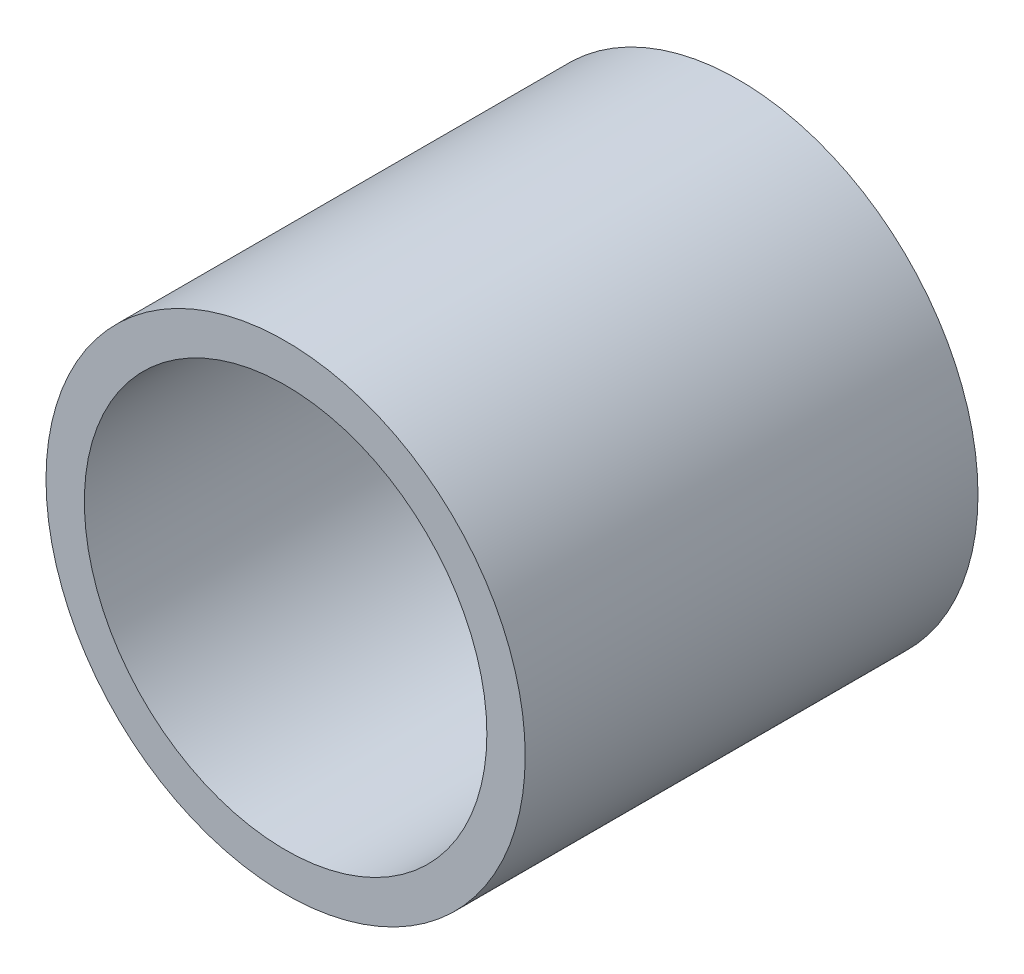
ISO-10303-21;
HEADER;
FILE_DESCRIPTION(('STEP AP214'),'2;1');
FILE_NAME('part.step','',(''),(''),'','','');
FILE_SCHEMA(('AUTOMOTIVE_DESIGN { 1 0 10303 214 1 1 1 1 }'));
ENDSEC;
DATA;
#1=APPLICATION_CONTEXT('core data for automotive mechanical design processes');
#2=APPLICATION_PROTOCOL_DEFINITION('international standard','automotive_design',2000,#1);
#3=PRODUCT_CONTEXT('',#1,'mechanical');
#4=PRODUCT('Part','Part','',(#3));
#5=PRODUCT_RELATED_PRODUCT_CATEGORY('part','',(#4));
#6=PRODUCT_DEFINITION_FORMATION('','',#4);
#7=PRODUCT_DEFINITION_CONTEXT('part definition',#1,'design');
#8=PRODUCT_DEFINITION('design','',#6,#7);
#9=PRODUCT_DEFINITION_SHAPE('','',#8);
#10=(LENGTH_UNIT() NAMED_UNIT(*) SI_UNIT(.MILLI.,.METRE.));
#11=(NAMED_UNIT(*) PLANE_ANGLE_UNIT() SI_UNIT($,.RADIAN.));
#12=(NAMED_UNIT(*) SI_UNIT($,.STERADIAN.) SOLID_ANGLE_UNIT());
#13=UNCERTAINTY_MEASURE_WITH_UNIT(LENGTH_MEASURE(1.E-05),#10,'distance_accuracy_value','');
#14=(GEOMETRIC_REPRESENTATION_CONTEXT(3) GLOBAL_UNCERTAINTY_ASSIGNED_CONTEXT((#13)) GLOBAL_UNIT_ASSIGNED_CONTEXT((#10,
#11,#12)) REPRESENTATION_CONTEXT('',''));
#15=CARTESIAN_POINT('',(0.,0.,0.));
#16=DIRECTION('',(0.,0.,1.));
#17=DIRECTION('',(1.,0.,0.));
#18=AXIS2_PLACEMENT_3D('',#15,#16,#17);
#19=CARTESIAN_POINT('',(0.,0.,6.));
#20=DIRECTION('',(0.,0.,1.));
#21=DIRECTION('',(1.,0.,0.));
#22=AXIS2_PLACEMENT_3D('',#19,#20,#21);
#23=PLANE('',#22);
#24=CARTESIAN_POINT('',(0.,0.,6.));
#25=DIRECTION('',(0.,0.,1.));
#26=DIRECTION('',(1.,0.,0.));
#27=AXIS2_PLACEMENT_3D('',#24,#25,#26);
#28=CIRCLE('',#27,3.175);
#29=CARTESIAN_POINT('',(3.175,0.,6.));
#30=VERTEX_POINT('',#29);
#31=EDGE_CURVE('E10',#30,#30,#28,.T.);
#32=ORIENTED_EDGE('',*,*,#31,.T.);
#33=EDGE_LOOP('',(#32));
#34=FACE_BOUND('',#33,.T.);
#35=CARTESIAN_POINT('',(0.,0.,6.));
#36=DIRECTION('',(0.,0.,1.));
#37=DIRECTION('',(1.,0.,0.));
#38=AXIS2_PLACEMENT_3D('',#35,#36,#37);
#39=CIRCLE('',#38,2.667);
#40=CARTESIAN_POINT('',(2.667,0.,6.));
#41=VERTEX_POINT('',#40);
#42=EDGE_CURVE('E50',#41,#41,#39,.T.);
#43=ORIENTED_EDGE('',*,*,#42,.F.);
#44=EDGE_LOOP('',(#43));
#45=FACE_BOUND('',#44,.T.);
#46=ADVANCED_FACE('F37',(#34,#45),#23,.T.);
#47=CARTESIAN_POINT('',(0.,0.,0.));
#48=DIRECTION('',(0.,0.,1.));
#49=DIRECTION('',(1.,0.,0.));
#50=AXIS2_PLACEMENT_3D('',#47,#48,#49);
#51=PLANE('',#50);
#52=CARTESIAN_POINT('',(0.,0.,0.));
#53=DIRECTION('',(0.,0.,1.));
#54=DIRECTION('',(1.,0.,0.));
#55=AXIS2_PLACEMENT_3D('',#52,#53,#54);
#56=CIRCLE('',#55,3.175);
#57=CARTESIAN_POINT('',(3.175,0.,0.));
#58=VERTEX_POINT('',#57);
#59=EDGE_CURVE('E41',#58,#58,#56,.T.);
#60=ORIENTED_EDGE('',*,*,#59,.F.);
#61=EDGE_LOOP('',(#60));
#62=FACE_BOUND('',#61,.T.);
#63=CARTESIAN_POINT('',(0.,0.,0.));
#64=DIRECTION('',(0.,0.,1.));
#65=DIRECTION('',(1.,0.,0.));
#66=AXIS2_PLACEMENT_3D('',#63,#64,#65);
#67=CIRCLE('',#66,2.667);
#68=CARTESIAN_POINT('',(2.667,0.,0.));
#69=VERTEX_POINT('',#68);
#70=EDGE_CURVE('E52',#69,#69,#67,.T.);
#71=ORIENTED_EDGE('',*,*,#70,.T.);
#72=EDGE_LOOP('',(#71));
#73=FACE_BOUND('',#72,.T.);
#74=ADVANCED_FACE('F64',(#62,#73),#51,.F.);
#75=CARTESIAN_POINT('',(0.,0.,6.));
#76=DIRECTION('',(0.,0.,-1.));
#77=DIRECTION('',(-1.,0.,0.));
#78=AXIS2_PLACEMENT_3D('',#75,#76,#77);
#79=CYLINDRICAL_SURFACE('',#78,3.175);
#80=ORIENTED_EDGE('',*,*,#31,.F.);
#81=EDGE_LOOP('',(#80));
#82=FACE_BOUND('',#81,.T.);
#83=ORIENTED_EDGE('',*,*,#59,.T.);
#84=EDGE_LOOP('',(#83));
#85=FACE_BOUND('',#84,.T.);
#86=ADVANCED_FACE('F39',(#82,#85),#79,.T.);
#87=CARTESIAN_POINT('',(0.,0.,6.));
#88=DIRECTION('',(0.,0.,-1.));
#89=DIRECTION('',(-1.,0.,0.));
#90=AXIS2_PLACEMENT_3D('',#87,#88,#89);
#91=CYLINDRICAL_SURFACE('',#90,2.667);
#92=ORIENTED_EDGE('',*,*,#42,.T.);
#93=EDGE_LOOP('',(#92));
#94=FACE_BOUND('',#93,.T.);
#95=ORIENTED_EDGE('',*,*,#70,.F.);
#96=EDGE_LOOP('',(#95));
#97=FACE_BOUND('',#96,.T.);
#98=ADVANCED_FACE('F60',(#94,#97),#91,.F.);
#99=CLOSED_SHELL('',(#46,#74,#86,#98));
#100=MANIFOLD_SOLID_BREP('B2',#99);
#101=ADVANCED_BREP_SHAPE_REPRESENTATION('',(#18,#100),#14);
#102=SHAPE_DEFINITION_REPRESENTATION(#9,#101);
ENDSEC;
END-ISO-10303-21;
